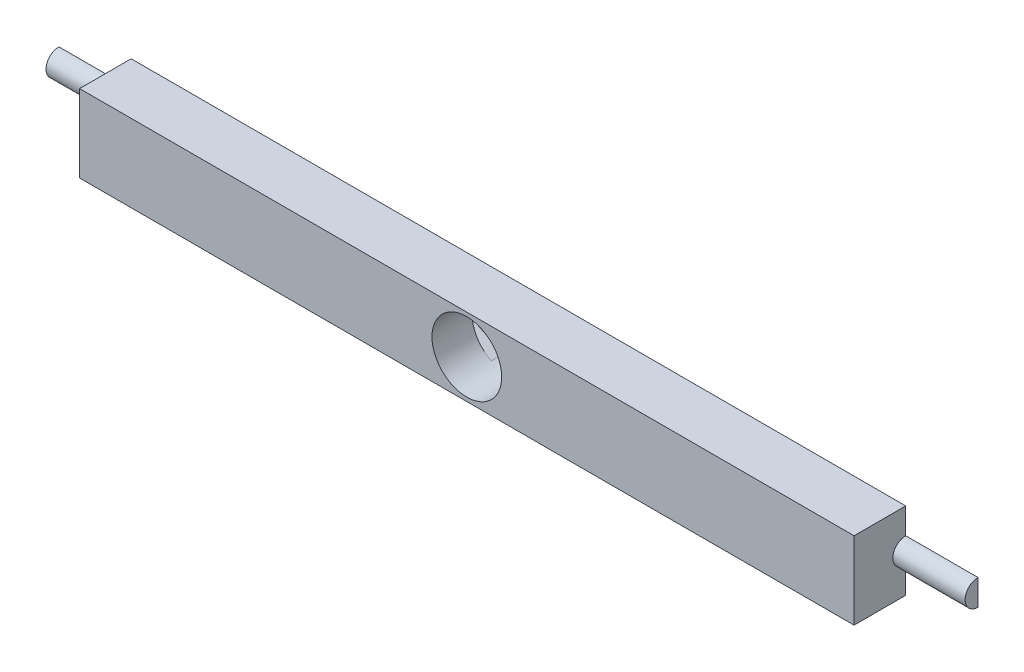
ISO-10303-21;
HEADER;
FILE_DESCRIPTION(('STEP AP214'),'2;1');
FILE_NAME('part.step','',(''),(''),'','','');
FILE_SCHEMA(('AUTOMOTIVE_DESIGN { 1 0 10303 214 1 1 1 1 }'));
ENDSEC;
DATA;
#1=APPLICATION_CONTEXT('core data for automotive mechanical design processes');
#2=APPLICATION_PROTOCOL_DEFINITION('international standard','automotive_design',2000,#1);
#3=PRODUCT_CONTEXT('',#1,'mechanical');
#4=PRODUCT('Part','Part','',(#3));
#5=PRODUCT_RELATED_PRODUCT_CATEGORY('part','',(#4));
#6=PRODUCT_DEFINITION_FORMATION('','',#4);
#7=PRODUCT_DEFINITION_CONTEXT('part definition',#1,'design');
#8=PRODUCT_DEFINITION('design','',#6,#7);
#9=PRODUCT_DEFINITION_SHAPE('','',#8);
#10=(LENGTH_UNIT() NAMED_UNIT(*) SI_UNIT(.MILLI.,.METRE.));
#11=(NAMED_UNIT(*) PLANE_ANGLE_UNIT() SI_UNIT($,.RADIAN.));
#12=(NAMED_UNIT(*) SI_UNIT($,.STERADIAN.) SOLID_ANGLE_UNIT());
#13=UNCERTAINTY_MEASURE_WITH_UNIT(LENGTH_MEASURE(1.E-05),#10,'distance_accuracy_value','');
#14=(GEOMETRIC_REPRESENTATION_CONTEXT(3) GLOBAL_UNCERTAINTY_ASSIGNED_CONTEXT((#13)) GLOBAL_UNIT_ASSIGNED_CONTEXT((#10,
#11,#12)) REPRESENTATION_CONTEXT('',''));
#15=CARTESIAN_POINT('',(0.,0.,0.));
#16=DIRECTION('',(0.,0.,1.));
#17=DIRECTION('',(1.,0.,0.));
#18=AXIS2_PLACEMENT_3D('',#15,#16,#17);
#19=CARTESIAN_POINT('',(150.,0.,20.));
#20=DIRECTION('',(0.,-1.,0.));
#21=DIRECTION('',(0.,0.,-1.));
#22=AXIS2_PLACEMENT_3D('',#19,#20,#21);
#23=PLANE('',#22);
#24=DIRECTION('',(-1.,0.,0.));
#25=VECTOR('',#24,1.);
#26=CARTESIAN_POINT('',(150.,0.,0.));
#27=LINE('',#26,#25);
#28=CARTESIAN_POINT('',(150.,0.,0.));
#29=VERTEX_POINT('',#28);
#30=CARTESIAN_POINT('',(-150.,0.,0.));
#31=VERTEX_POINT('',#30);
#32=EDGE_CURVE('E255',#29,#31,#27,.T.);
#33=ORIENTED_EDGE('',*,*,#32,.F.);
#34=DIRECTION('',(0.,0.,-1.));
#35=VECTOR('',#34,1.);
#36=CARTESIAN_POINT('',(150.,0.,20.));
#37=LINE('',#36,#35);
#38=CARTESIAN_POINT('',(150.,0.,20.));
#39=VERTEX_POINT('',#38);
#40=EDGE_CURVE('E11',#39,#29,#37,.T.);
#41=ORIENTED_EDGE('',*,*,#40,.F.);
#42=DIRECTION('',(-1.,0.,0.));
#43=VECTOR('',#42,1.);
#44=CARTESIAN_POINT('',(150.,0.,20.));
#45=LINE('',#44,#43);
#46=CARTESIAN_POINT('',(-150.,0.,20.));
#47=VERTEX_POINT('',#46);
#48=EDGE_CURVE('E256',#39,#47,#45,.T.);
#49=ORIENTED_EDGE('',*,*,#48,.T.);
#50=DIRECTION('',(0.,0.,-1.));
#51=VECTOR('',#50,1.);
#52=CARTESIAN_POINT('',(-150.,0.,20.));
#53=LINE('',#52,#51);
#54=EDGE_CURVE('E44',#47,#31,#53,.T.);
#55=ORIENTED_EDGE('',*,*,#54,.T.);
#56=EDGE_LOOP('',(#33,#41,#49,#55));
#57=FACE_BOUND('',#56,.T.);
#58=ADVANCED_FACE('F41',(#57),#23,.T.);
#59=CARTESIAN_POINT('',(150.,30.,20.));
#60=DIRECTION('',(1.,0.,0.));
#61=DIRECTION('',(0.,0.,-1.));
#62=AXIS2_PLACEMENT_3D('',#59,#60,#61);
#63=PLANE('',#62);
#64=CARTESIAN_POINT('',(150.,15.,0.));
#65=DIRECTION('',(1.,0.,0.));
#66=DIRECTION('',(0.,0.,-1.));
#67=AXIS2_PLACEMENT_3D('',#64,#65,#66);
#68=CIRCLE('',#67,5.);
#69=CARTESIAN_POINT('',(150.,20.,0.));
#70=VERTEX_POINT('',#69);
#71=CARTESIAN_POINT('',(150.,10.,0.));
#72=VERTEX_POINT('',#71);
#73=EDGE_CURVE('E252',#70,#72,#68,.T.);
#74=ORIENTED_EDGE('',*,*,#73,.F.);
#75=DIRECTION('',(0.,-1.,0.));
#76=VECTOR('',#75,1.);
#77=CARTESIAN_POINT('',(150.,30.,0.));
#78=LINE('',#77,#76);
#79=CARTESIAN_POINT('',(150.,30.,0.));
#80=VERTEX_POINT('',#79);
#81=EDGE_CURVE('E260',#80,#70,#78,.T.);
#82=ORIENTED_EDGE('',*,*,#81,.F.);
#83=DIRECTION('',(0.,0.,-1.));
#84=VECTOR('',#83,1.);
#85=CARTESIAN_POINT('',(150.,30.,20.));
#86=LINE('',#85,#84);
#87=CARTESIAN_POINT('',(150.,30.,20.));
#88=VERTEX_POINT('',#87);
#89=EDGE_CURVE('E49',#88,#80,#86,.T.);
#90=ORIENTED_EDGE('',*,*,#89,.F.);
#91=DIRECTION('',(0.,-1.,0.));
#92=VECTOR('',#91,1.);
#93=CARTESIAN_POINT('',(150.,30.,20.));
#94=LINE('',#93,#92);
#95=EDGE_CURVE('E266',#88,#39,#94,.T.);
#96=ORIENTED_EDGE('',*,*,#95,.T.);
#97=ORIENTED_EDGE('',*,*,#40,.T.);
#98=EDGE_CURVE('E278',#72,#29,#78,.T.);
#99=ORIENTED_EDGE('',*,*,#98,.F.);
#100=EDGE_LOOP('',(#74,#82,#90,#96,#97,#99));
#101=FACE_BOUND('',#100,.T.);
#102=ADVANCED_FACE('F295',(#101),#63,.T.);
#103=CARTESIAN_POINT('',(-150.,30.,20.));
#104=DIRECTION('',(0.,1.,0.));
#105=DIRECTION('',(0.,0.,1.));
#106=AXIS2_PLACEMENT_3D('',#103,#104,#105);
#107=PLANE('',#106);
#108=DIRECTION('',(1.,0.,0.));
#109=VECTOR('',#108,1.);
#110=CARTESIAN_POINT('',(-150.,30.,0.));
#111=LINE('',#110,#109);
#112=CARTESIAN_POINT('',(-150.,30.,0.));
#113=VERTEX_POINT('',#112);
#114=EDGE_CURVE('E275',#113,#80,#111,.T.);
#115=ORIENTED_EDGE('',*,*,#114,.F.);
#116=DIRECTION('',(0.,0.,-1.));
#117=VECTOR('',#116,1.);
#118=CARTESIAN_POINT('',(-150.,30.,20.));
#119=LINE('',#118,#117);
#120=CARTESIAN_POINT('',(-150.,30.,20.));
#121=VERTEX_POINT('',#120);
#122=EDGE_CURVE('E281',#121,#113,#119,.T.);
#123=ORIENTED_EDGE('',*,*,#122,.F.);
#124=DIRECTION('',(1.,0.,0.));
#125=VECTOR('',#124,1.);
#126=CARTESIAN_POINT('',(-150.,30.,20.));
#127=LINE('',#126,#125);
#128=EDGE_CURVE('E263',#121,#88,#127,.T.);
#129=ORIENTED_EDGE('',*,*,#128,.T.);
#130=ORIENTED_EDGE('',*,*,#89,.T.);
#131=EDGE_LOOP('',(#115,#123,#129,#130));
#132=FACE_BOUND('',#131,.T.);
#133=ADVANCED_FACE('F301',(#132),#107,.T.);
#134=CARTESIAN_POINT('',(-150.,0.,20.));
#135=DIRECTION('',(-1.,0.,0.));
#136=DIRECTION('',(0.,0.,1.));
#137=AXIS2_PLACEMENT_3D('',#134,#135,#136);
#138=PLANE('',#137);
#139=CARTESIAN_POINT('',(-150.,15.,0.));
#140=DIRECTION('',(-1.,0.,0.));
#141=DIRECTION('',(0.,0.,1.));
#142=AXIS2_PLACEMENT_3D('',#139,#140,#141);
#143=CIRCLE('',#142,5.);
#144=CARTESIAN_POINT('',(-150.,10.,0.));
#145=VERTEX_POINT('',#144);
#146=CARTESIAN_POINT('',(-150.,20.,0.));
#147=VERTEX_POINT('',#146);
#148=EDGE_CURVE('E245',#145,#147,#143,.T.);
#149=ORIENTED_EDGE('',*,*,#148,.F.);
#150=DIRECTION('',(0.,1.,0.));
#151=VECTOR('',#150,1.);
#152=CARTESIAN_POINT('',(-150.,0.,0.));
#153=LINE('',#152,#151);
#154=EDGE_CURVE('E272',#31,#145,#153,.T.);
#155=ORIENTED_EDGE('',*,*,#154,.F.);
#156=ORIENTED_EDGE('',*,*,#54,.F.);
#157=DIRECTION('',(0.,1.,0.));
#158=VECTOR('',#157,1.);
#159=CARTESIAN_POINT('',(-150.,0.,20.));
#160=LINE('',#159,#158);
#161=EDGE_CURVE('E259',#47,#121,#160,.T.);
#162=ORIENTED_EDGE('',*,*,#161,.T.);
#163=ORIENTED_EDGE('',*,*,#122,.T.);
#164=EDGE_CURVE('E271',#147,#113,#153,.T.);
#165=ORIENTED_EDGE('',*,*,#164,.F.);
#166=EDGE_LOOP('',(#149,#155,#156,#162,#163,#165));
#167=FACE_BOUND('',#166,.T.);
#168=ADVANCED_FACE('F290',(#167),#138,.T.);
#169=CARTESIAN_POINT('',(0.,0.,20.));
#170=DIRECTION('',(0.,0.,-1.));
#171=DIRECTION('',(-1.,0.,0.));
#172=AXIS2_PLACEMENT_3D('',#169,#170,#171);
#173=PLANE('',#172);
#174=CARTESIAN_POINT('',(0.,15.,20.));
#175=DIRECTION('',(0.,0.,-1.));
#176=DIRECTION('',(-1.,0.,0.));
#177=AXIS2_PLACEMENT_3D('',#174,#175,#176);
#178=CIRCLE('',#177,13.5);
#179=CARTESIAN_POINT('',(-13.5,15.,20.));
#180=VERTEX_POINT('',#179);
#181=EDGE_CURVE('E223',#180,#180,#178,.T.);
#182=ORIENTED_EDGE('',*,*,#181,.T.);
#183=EDGE_LOOP('',(#182));
#184=FACE_BOUND('',#183,.T.);
#185=ORIENTED_EDGE('',*,*,#48,.F.);
#186=ORIENTED_EDGE('',*,*,#95,.F.);
#187=ORIENTED_EDGE('',*,*,#128,.F.);
#188=ORIENTED_EDGE('',*,*,#161,.F.);
#189=EDGE_LOOP('',(#185,#186,#187,#188));
#190=FACE_BOUND('',#189,.T.);
#191=ADVANCED_FACE('F298',(#184,#190),#173,.F.);
#192=CARTESIAN_POINT('',(0.,0.,0.));
#193=DIRECTION('',(0.,0.,-1.));
#194=DIRECTION('',(-1.,0.,0.));
#195=AXIS2_PLACEMENT_3D('',#192,#193,#194);
#196=PLANE('',#195);
#197=DIRECTION('',(0.895059893691129,-0.445945945945946,0.));
#198=VECTOR('',#197,1.);
#199=CARTESIAN_POINT('',(12.0074952348258,24.1002917642459,0.));
#200=LINE('',#199,#198);
#201=CARTESIAN_POINT('',(6.02027027027027,27.0833085648302,0.));
#202=VERTEX_POINT('',#201);
#203=CARTESIAN_POINT('',(20.8412162162162,19.6990644418784,0.));
#204=VERTEX_POINT('',#203);
#205=EDGE_CURVE('E162',#202,#204,#200,.T.);
#206=ORIENTED_EDGE('',*,*,#205,.F.);
#207=CARTESIAN_POINT('',(0.,15.,0.));
#208=DIRECTION('',(0.,0.,-1.));
#209=DIRECTION('',(-1.,0.,0.));
#210=AXIS2_PLACEMENT_3D('',#207,#208,#209);
#211=CIRCLE('',#210,13.5);
#212=CARTESIAN_POINT('',(-6.02027027027027,27.0833085648302,0.));
#213=VERTEX_POINT('',#212);
#214=EDGE_CURVE('E227',#213,#202,#211,.T.);
#215=ORIENTED_EDGE('',*,*,#214,.F.);
#216=DIRECTION('',(-0.895059893691129,-0.445945945945946,0.));
#217=VECTOR('',#216,1.);
#218=CARTESIAN_POINT('',(-12.0074952348258,24.1002917642459,0.));
#219=LINE('',#218,#217);
#220=CARTESIAN_POINT('',(-20.8412162162162,19.6990644418784,0.));
#221=VERTEX_POINT('',#220);
#222=EDGE_CURVE('E211',#213,#221,#219,.T.);
#223=ORIENTED_EDGE('',*,*,#222,.T.);
#224=CARTESIAN_POINT('',(-18.5,15.,0.));
#225=DIRECTION('',(0.,0.,-1.));
#226=DIRECTION('',(-1.,0.,0.));
#227=AXIS2_PLACEMENT_3D('',#224,#225,#226);
#228=CIRCLE('',#227,5.25);
#229=CARTESIAN_POINT('',(-20.8412162162162,10.3009355581216,0.));
#230=VERTEX_POINT('',#229);
#231=EDGE_CURVE('E208',#221,#230,#228,.F.);
#232=ORIENTED_EDGE('',*,*,#231,.T.);
#233=DIRECTION('',(-0.895059893691129,0.445945945945946,0.));
#234=VECTOR('',#233,1.);
#235=CARTESIAN_POINT('',(-0.0330453057147466,-0.0663253654146171,0.));
#236=LINE('',#235,#234);
#237=CARTESIAN_POINT('',(-6.02027027027027,2.91669143516975,0.));
#238=VERTEX_POINT('',#237);
#239=EDGE_CURVE('E199',#238,#230,#236,.T.);
#240=ORIENTED_EDGE('',*,*,#239,.F.);
#241=CARTESIAN_POINT('',(6.02027027027027,2.91669143516975,0.));
#242=VERTEX_POINT('',#241);
#243=EDGE_CURVE('E194',#242,#238,#211,.T.);
#244=ORIENTED_EDGE('',*,*,#243,.F.);
#245=DIRECTION('',(0.895059893691129,0.445945945945946,0.));
#246=VECTOR('',#245,1.);
#247=CARTESIAN_POINT('',(0.0330453057147466,-0.0663253654146171,0.));
#248=LINE('',#247,#246);
#249=CARTESIAN_POINT('',(20.8412162162162,10.3009355581216,0.));
#250=VERTEX_POINT('',#249);
#251=EDGE_CURVE('E178',#242,#250,#248,.T.);
#252=ORIENTED_EDGE('',*,*,#251,.T.);
#253=CARTESIAN_POINT('',(18.5,15.,0.));
#254=DIRECTION('',(0.,0.,-1.));
#255=DIRECTION('',(-1.,0.,0.));
#256=AXIS2_PLACEMENT_3D('',#253,#254,#255);
#257=CIRCLE('',#256,5.25);
#258=EDGE_CURVE('E181',#204,#250,#257,.T.);
#259=ORIENTED_EDGE('',*,*,#258,.F.);
#260=EDGE_LOOP('',(#206,#215,#223,#232,#240,#244,#252,#259));
#261=FACE_BOUND('',#260,.T.);
#262=ORIENTED_EDGE('',*,*,#81,.T.);
#263=DIRECTION('',(-1.,0.,0.));
#264=VECTOR('',#263,1.);
#265=CARTESIAN_POINT('',(178.,20.,0.));
#266=LINE('',#265,#264);
#267=CARTESIAN_POINT('',(178.,20.,0.));
#268=VERTEX_POINT('',#267);
#269=EDGE_CURVE('E242',#268,#70,#266,.T.);
#270=ORIENTED_EDGE('',*,*,#269,.F.);
#271=DIRECTION('',(0.,-1.,0.));
#272=VECTOR('',#271,1.);
#273=CARTESIAN_POINT('',(178.,20.,0.));
#274=LINE('',#273,#272);
#275=CARTESIAN_POINT('',(178.,10.,0.));
#276=VERTEX_POINT('',#275);
#277=EDGE_CURVE('E235',#268,#276,#274,.T.);
#278=ORIENTED_EDGE('',*,*,#277,.T.);
#279=DIRECTION('',(-1.,0.,0.));
#280=VECTOR('',#279,1.);
#281=CARTESIAN_POINT('',(178.,10.,0.));
#282=LINE('',#281,#280);
#283=EDGE_CURVE('E247',#276,#72,#282,.T.);
#284=ORIENTED_EDGE('',*,*,#283,.T.);
#285=ORIENTED_EDGE('',*,*,#98,.T.);
#286=ORIENTED_EDGE('',*,*,#32,.T.);
#287=ORIENTED_EDGE('',*,*,#154,.T.);
#288=CARTESIAN_POINT('',(-178.,10.,0.));
#289=VERTEX_POINT('',#288);
#290=EDGE_CURVE('E241',#145,#289,#282,.T.);
#291=ORIENTED_EDGE('',*,*,#290,.T.);
#292=DIRECTION('',(0.,-1.,0.));
#293=VECTOR('',#292,1.);
#294=CARTESIAN_POINT('',(-178.,20.,0.));
#295=LINE('',#294,#293);
#296=CARTESIAN_POINT('',(-178.,20.,0.));
#297=VERTEX_POINT('',#296);
#298=EDGE_CURVE('E226',#297,#289,#295,.T.);
#299=ORIENTED_EDGE('',*,*,#298,.F.);
#300=EDGE_CURVE('E246',#147,#297,#266,.T.);
#301=ORIENTED_EDGE('',*,*,#300,.F.);
#302=ORIENTED_EDGE('',*,*,#164,.T.);
#303=ORIENTED_EDGE('',*,*,#114,.T.);
#304=EDGE_LOOP('',(#262,#270,#278,#284,#285,#286,#287,#291,#299,#301,#302,#303));
#305=FACE_BOUND('',#304,.T.);
#306=ADVANCED_FACE('F293',(#261,#305),#196,.T.);
#307=CARTESIAN_POINT('',(-178.,15.,0.));
#308=DIRECTION('',(-1.,0.,0.));
#309=DIRECTION('',(0.,0.,1.));
#310=AXIS2_PLACEMENT_3D('',#307,#308,#309);
#311=PLANE('',#310);
#312=ORIENTED_EDGE('',*,*,#298,.T.);
#313=CARTESIAN_POINT('',(-178.,15.,0.));
#314=DIRECTION('',(-1.,0.,0.));
#315=DIRECTION('',(0.,0.,1.));
#316=AXIS2_PLACEMENT_3D('',#313,#314,#315);
#317=CIRCLE('',#316,5.);
#318=EDGE_CURVE('E232',#289,#297,#317,.T.);
#319=ORIENTED_EDGE('',*,*,#318,.T.);
#320=EDGE_LOOP('',(#312,#319));
#321=FACE_BOUND('',#320,.T.);
#322=ADVANCED_FACE('F343',(#321),#311,.T.);
#323=CARTESIAN_POINT('',(178.,15.,0.));
#324=DIRECTION('',(-1.,0.,0.));
#325=DIRECTION('',(0.,0.,1.));
#326=AXIS2_PLACEMENT_3D('',#323,#324,#325);
#327=CYLINDRICAL_SURFACE('',#326,5.);
#328=ORIENTED_EDGE('',*,*,#290,.F.);
#329=ORIENTED_EDGE('',*,*,#148,.T.);
#330=ORIENTED_EDGE('',*,*,#300,.T.);
#331=ORIENTED_EDGE('',*,*,#318,.F.);
#332=EDGE_LOOP('',(#328,#329,#330,#331));
#333=FACE_BOUND('',#332,.T.);
#334=ADVANCED_FACE('F321',(#333),#327,.T.);
#335=ORIENTED_EDGE('',*,*,#269,.T.);
#336=ORIENTED_EDGE('',*,*,#73,.T.);
#337=ORIENTED_EDGE('',*,*,#283,.F.);
#338=CARTESIAN_POINT('',(178.,15.,0.));
#339=DIRECTION('',(-1.,0.,0.));
#340=DIRECTION('',(0.,0.,1.));
#341=AXIS2_PLACEMENT_3D('',#338,#339,#340);
#342=CIRCLE('',#341,5.);
#343=EDGE_CURVE('E238',#276,#268,#342,.T.);
#344=ORIENTED_EDGE('',*,*,#343,.T.);
#345=EDGE_LOOP('',(#335,#336,#337,#344));
#346=FACE_BOUND('',#345,.T.);
#347=ADVANCED_FACE('F305',(#346),#327,.T.);
#348=CARTESIAN_POINT('',(178.,15.,0.));
#349=DIRECTION('',(-1.,0.,0.));
#350=DIRECTION('',(0.,0.,1.));
#351=AXIS2_PLACEMENT_3D('',#348,#349,#350);
#352=PLANE('',#351);
#353=ORIENTED_EDGE('',*,*,#277,.F.);
#354=ORIENTED_EDGE('',*,*,#343,.F.);
#355=EDGE_LOOP('',(#353,#354));
#356=FACE_BOUND('',#355,.T.);
#357=ADVANCED_FACE('F309',(#356),#352,.F.);
#358=CARTESIAN_POINT('',(0.,15.,20.));
#359=DIRECTION('',(0.,0.,-1.));
#360=DIRECTION('',(-1.,0.,0.));
#361=AXIS2_PLACEMENT_3D('',#358,#359,#360);
#362=CYLINDRICAL_SURFACE('',#361,13.5);
#363=ORIENTED_EDGE('',*,*,#181,.F.);
#364=EDGE_LOOP('',(#363));
#365=FACE_BOUND('',#364,.T.);
#366=ORIENTED_EDGE('',*,*,#214,.T.);
#367=DIRECTION('',(0.,0.,-1.));
#368=VECTOR('',#367,1.);
#369=CARTESIAN_POINT('',(6.02027027027027,27.0833085648302,4.5));
#370=LINE('',#369,#368);
#371=CARTESIAN_POINT('',(6.02027027027027,27.0833085648302,4.5));
#372=VERTEX_POINT('',#371);
#373=EDGE_CURVE('E192',#372,#202,#370,.T.);
#374=ORIENTED_EDGE('',*,*,#373,.F.);
#375=CARTESIAN_POINT('',(0.,15.,4.5));
#376=DIRECTION('',(0.,0.,-1.));
#377=DIRECTION('',(-1.,0.,0.));
#378=AXIS2_PLACEMENT_3D('',#375,#376,#377);
#379=CIRCLE('',#378,13.5);
#380=CARTESIAN_POINT('',(6.02027027027027,2.91669143516976,4.5));
#381=VERTEX_POINT('',#380);
#382=EDGE_CURVE('E167',#372,#381,#379,.T.);
#383=ORIENTED_EDGE('',*,*,#382,.T.);
#384=DIRECTION('',(0.,0.,-1.));
#385=VECTOR('',#384,1.);
#386=CARTESIAN_POINT('',(6.02027027027027,2.91669143516975,4.5));
#387=LINE('',#386,#385);
#388=EDGE_CURVE('E57',#381,#242,#387,.T.);
#389=ORIENTED_EDGE('',*,*,#388,.T.);
#390=ORIENTED_EDGE('',*,*,#243,.T.);
#391=DIRECTION('',(0.,0.,-1.));
#392=VECTOR('',#391,1.);
#393=CARTESIAN_POINT('',(-6.02027027027027,2.91669143516975,4.5));
#394=LINE('',#393,#392);
#395=CARTESIAN_POINT('',(-6.02027027027027,2.91669143516975,4.5));
#396=VERTEX_POINT('',#395);
#397=EDGE_CURVE('E217',#396,#238,#394,.T.);
#398=ORIENTED_EDGE('',*,*,#397,.F.);
#399=CARTESIAN_POINT('',(0.,15.,4.5));
#400=DIRECTION('',(0.,0.,-1.));
#401=DIRECTION('',(-1.,0.,0.));
#402=AXIS2_PLACEMENT_3D('',#399,#400,#401);
#403=CIRCLE('',#402,13.5);
#404=CARTESIAN_POINT('',(-6.02027027027027,27.0833085648302,4.5));
#405=VERTEX_POINT('',#404);
#406=EDGE_CURVE('E201',#396,#405,#403,.T.);
#407=ORIENTED_EDGE('',*,*,#406,.T.);
#408=DIRECTION('',(0.,0.,-1.));
#409=VECTOR('',#408,1.);
#410=CARTESIAN_POINT('',(-6.02027027027027,27.0833085648302,4.5));
#411=LINE('',#410,#409);
#412=EDGE_CURVE('E219',#405,#213,#411,.T.);
#413=ORIENTED_EDGE('',*,*,#412,.T.);
#414=EDGE_LOOP('',(#366,#374,#383,#389,#390,#398,#407,#413));
#415=FACE_BOUND('',#414,.T.);
#416=ADVANCED_FACE('F311',(#365,#415),#362,.F.);
#417=CARTESIAN_POINT('',(-18.5,15.,4.5));
#418=DIRECTION('',(0.,0.,-1.));
#419=DIRECTION('',(-1.,0.,0.));
#420=AXIS2_PLACEMENT_3D('',#417,#418,#419);
#421=CYLINDRICAL_SURFACE('',#420,5.25);
#422=ORIENTED_EDGE('',*,*,#231,.F.);
#423=DIRECTION('',(0.,0.,-1.));
#424=VECTOR('',#423,1.);
#425=CARTESIAN_POINT('',(-20.8412162162162,19.6990644418784,4.5));
#426=LINE('',#425,#424);
#427=CARTESIAN_POINT('',(-20.8412162162162,19.6990644418784,4.5));
#428=VERTEX_POINT('',#427);
#429=EDGE_CURVE('E207',#428,#221,#426,.T.);
#430=ORIENTED_EDGE('',*,*,#429,.F.);
#431=CARTESIAN_POINT('',(-18.5,15.,4.5));
#432=DIRECTION('',(0.,0.,-1.));
#433=DIRECTION('',(-1.,0.,0.));
#434=AXIS2_PLACEMENT_3D('',#431,#432,#433);
#435=CIRCLE('',#434,5.25);
#436=CARTESIAN_POINT('',(-20.8412162162162,10.3009355581216,4.5));
#437=VERTEX_POINT('',#436);
#438=EDGE_CURVE('E197',#428,#437,#435,.F.);
#439=ORIENTED_EDGE('',*,*,#438,.T.);
#440=DIRECTION('',(0.,0.,-1.));
#441=VECTOR('',#440,1.);
#442=CARTESIAN_POINT('',(-20.8412162162162,10.3009355581216,4.5));
#443=LINE('',#442,#441);
#444=EDGE_CURVE('E190',#437,#230,#443,.T.);
#445=ORIENTED_EDGE('',*,*,#444,.T.);
#446=EDGE_LOOP('',(#422,#430,#439,#445));
#447=FACE_BOUND('',#446,.T.);
#448=ADVANCED_FACE('F318',(#447),#421,.F.);
#449=CARTESIAN_POINT('',(-0.0330453057147466,-0.0663253654146171,4.5));
#450=DIRECTION('',(-0.445945945945946,-0.895059893691129,0.));
#451=DIRECTION('',(0.895059893691129,-0.445945945945946,0.));
#452=AXIS2_PLACEMENT_3D('',#449,#450,#451);
#453=PLANE('',#452);
#454=ORIENTED_EDGE('',*,*,#239,.T.);
#455=ORIENTED_EDGE('',*,*,#444,.F.);
#456=DIRECTION('',(-0.895059893691129,0.445945945945946,0.));
#457=VECTOR('',#456,1.);
#458=CARTESIAN_POINT('',(-0.0330453057147466,-0.0663253654146171,4.5));
#459=LINE('',#458,#457);
#460=EDGE_CURVE('E204',#396,#437,#459,.T.);
#461=ORIENTED_EDGE('',*,*,#460,.F.);
#462=ORIENTED_EDGE('',*,*,#397,.T.);
#463=EDGE_LOOP('',(#454,#455,#461,#462));
#464=FACE_BOUND('',#463,.T.);
#465=ADVANCED_FACE('F357',(#464),#453,.F.);
#466=CARTESIAN_POINT('',(-12.0074952348258,24.1002917642459,4.5));
#467=DIRECTION('',(0.445945945945946,-0.895059893691129,0.));
#468=DIRECTION('',(0.895059893691129,0.445945945945946,0.));
#469=AXIS2_PLACEMENT_3D('',#466,#467,#468);
#470=PLANE('',#469);
#471=ORIENTED_EDGE('',*,*,#222,.F.);
#472=ORIENTED_EDGE('',*,*,#412,.F.);
#473=DIRECTION('',(-0.895059893691129,-0.445945945945946,0.));
#474=VECTOR('',#473,1.);
#475=CARTESIAN_POINT('',(-12.0074952348258,24.1002917642459,4.5));
#476=LINE('',#475,#474);
#477=EDGE_CURVE('E65',#405,#428,#476,.T.);
#478=ORIENTED_EDGE('',*,*,#477,.T.);
#479=ORIENTED_EDGE('',*,*,#429,.T.);
#480=EDGE_LOOP('',(#471,#472,#478,#479));
#481=FACE_BOUND('',#480,.T.);
#482=ADVANCED_FACE('F359',(#481),#470,.T.);
#483=CARTESIAN_POINT('',(0.,0.,4.5));
#484=DIRECTION('',(0.,0.,-1.));
#485=DIRECTION('',(-1.,0.,0.));
#486=AXIS2_PLACEMENT_3D('',#483,#484,#485);
#487=PLANE('',#486);
#488=ORIENTED_EDGE('',*,*,#438,.F.);
#489=ORIENTED_EDGE('',*,*,#477,.F.);
#490=ORIENTED_EDGE('',*,*,#406,.F.);
#491=ORIENTED_EDGE('',*,*,#460,.T.);
#492=EDGE_LOOP('',(#488,#489,#490,#491));
#493=FACE_BOUND('',#492,.T.);
#494=CARTESIAN_POINT('',(-18.5,15.,4.5));
#495=DIRECTION('',(0.,0.,-1.));
#496=DIRECTION('',(-1.,0.,0.));
#497=AXIS2_PLACEMENT_3D('',#494,#495,#496);
#498=CIRCLE('',#497,2.4);
#499=CARTESIAN_POINT('',(-20.9,15.,4.5));
#500=VERTEX_POINT('',#499);
#501=EDGE_CURVE('E184',#500,#500,#498,.T.);
#502=ORIENTED_EDGE('',*,*,#501,.F.);
#503=EDGE_LOOP('',(#502));
#504=FACE_BOUND('',#503,.T.);
#505=ADVANCED_FACE('F362',(#493,#504),#487,.T.);
#506=CARTESIAN_POINT('',(12.0074952348258,24.1002917642459,4.5));
#507=DIRECTION('',(0.445945945945946,0.895059893691129,0.));
#508=DIRECTION('',(-0.895059893691129,0.445945945945946,0.));
#509=AXIS2_PLACEMENT_3D('',#506,#507,#508);
#510=PLANE('',#509);
#511=ORIENTED_EDGE('',*,*,#205,.T.);
#512=DIRECTION('',(0.,0.,-1.));
#513=VECTOR('',#512,1.);
#514=CARTESIAN_POINT('',(20.8412162162162,19.6990644418784,4.5));
#515=LINE('',#514,#513);
#516=CARTESIAN_POINT('',(20.8412162162162,19.6990644418784,4.5));
#517=VERTEX_POINT('',#516);
#518=EDGE_CURVE('E155',#517,#204,#515,.T.);
#519=ORIENTED_EDGE('',*,*,#518,.F.);
#520=DIRECTION('',(0.895059893691129,-0.445945945945946,0.));
#521=VECTOR('',#520,1.);
#522=CARTESIAN_POINT('',(12.0074952348258,24.1002917642459,4.5));
#523=LINE('',#522,#521);
#524=EDGE_CURVE('E159',#372,#517,#523,.T.);
#525=ORIENTED_EDGE('',*,*,#524,.F.);
#526=ORIENTED_EDGE('',*,*,#373,.T.);
#527=EDGE_LOOP('',(#511,#519,#525,#526));
#528=FACE_BOUND('',#527,.T.);
#529=ADVANCED_FACE('F157',(#528),#510,.F.);
#530=CARTESIAN_POINT('',(0.0330453057147466,-0.0663253654146171,4.5));
#531=DIRECTION('',(-0.445945945945946,0.895059893691129,0.));
#532=DIRECTION('',(-0.895059893691129,-0.445945945945946,0.));
#533=AXIS2_PLACEMENT_3D('',#530,#531,#532);
#534=PLANE('',#533);
#535=ORIENTED_EDGE('',*,*,#251,.F.);
#536=ORIENTED_EDGE('',*,*,#388,.F.);
#537=DIRECTION('',(0.895059893691129,0.445945945945946,0.));
#538=VECTOR('',#537,1.);
#539=CARTESIAN_POINT('',(0.0330453057147466,-0.0663253654146171,4.5));
#540=LINE('',#539,#538);
#541=CARTESIAN_POINT('',(20.8412162162162,10.3009355581216,4.5));
#542=VERTEX_POINT('',#541);
#543=EDGE_CURVE('E174',#381,#542,#540,.T.);
#544=ORIENTED_EDGE('',*,*,#543,.T.);
#545=DIRECTION('',(0.,0.,-1.));
#546=VECTOR('',#545,1.);
#547=CARTESIAN_POINT('',(20.8412162162162,10.3009355581216,4.5));
#548=LINE('',#547,#546);
#549=EDGE_CURVE('E166',#542,#250,#548,.T.);
#550=ORIENTED_EDGE('',*,*,#549,.T.);
#551=EDGE_LOOP('',(#535,#536,#544,#550));
#552=FACE_BOUND('',#551,.T.);
#553=ADVANCED_FACE('F371',(#552),#534,.T.);
#554=CARTESIAN_POINT('',(18.5,15.,4.5));
#555=DIRECTION('',(0.,0.,-1.));
#556=DIRECTION('',(-1.,0.,0.));
#557=AXIS2_PLACEMENT_3D('',#554,#555,#556);
#558=CYLINDRICAL_SURFACE('',#557,5.25);
#559=ORIENTED_EDGE('',*,*,#258,.T.);
#560=ORIENTED_EDGE('',*,*,#549,.F.);
#561=CARTESIAN_POINT('',(18.5,15.,4.5));
#562=DIRECTION('',(0.,0.,-1.));
#563=DIRECTION('',(-1.,0.,0.));
#564=AXIS2_PLACEMENT_3D('',#561,#562,#563);
#565=CIRCLE('',#564,5.25);
#566=EDGE_CURVE('E171',#517,#542,#565,.T.);
#567=ORIENTED_EDGE('',*,*,#566,.F.);
#568=ORIENTED_EDGE('',*,*,#518,.T.);
#569=EDGE_LOOP('',(#559,#560,#567,#568));
#570=FACE_BOUND('',#569,.T.);
#571=ADVANCED_FACE('F172',(#570),#558,.F.);
#572=CARTESIAN_POINT('',(0.,0.,4.5));
#573=DIRECTION('',(0.,0.,-1.));
#574=DIRECTION('',(-1.,0.,0.));
#575=AXIS2_PLACEMENT_3D('',#572,#573,#574);
#576=PLANE('',#575);
#577=CARTESIAN_POINT('',(18.5,15.,4.5));
#578=DIRECTION('',(0.,0.,-1.));
#579=DIRECTION('',(-1.,0.,0.));
#580=AXIS2_PLACEMENT_3D('',#577,#578,#579);
#581=CIRCLE('',#580,2.4);
#582=CARTESIAN_POINT('',(16.1,15.,4.5));
#583=VERTEX_POINT('',#582);
#584=EDGE_CURVE('E400',#583,#583,#581,.F.);
#585=ORIENTED_EDGE('',*,*,#584,.T.);
#586=EDGE_LOOP('',(#585));
#587=FACE_BOUND('',#586,.T.);
#588=ORIENTED_EDGE('',*,*,#524,.T.);
#589=ORIENTED_EDGE('',*,*,#566,.T.);
#590=ORIENTED_EDGE('',*,*,#543,.F.);
#591=ORIENTED_EDGE('',*,*,#382,.F.);
#592=EDGE_LOOP('',(#588,#589,#590,#591));
#593=FACE_BOUND('',#592,.T.);
#594=ADVANCED_FACE('F176',(#587,#593),#576,.T.);
#595=CARTESIAN_POINT('',(18.5,15.,5.));
#596=DIRECTION('',(0.,0.,-1.));
#597=DIRECTION('',(-1.,0.,0.));
#598=AXIS2_PLACEMENT_3D('',#595,#596,#597);
#599=CYLINDRICAL_SURFACE('',#598,2.4);
#600=ORIENTED_EDGE('',*,*,#584,.F.);
#601=EDGE_LOOP('',(#600));
#602=FACE_BOUND('',#601,.T.);
#603=CARTESIAN_POINT('',(18.5,15.,5.));
#604=DIRECTION('',(0.,0.,-1.));
#605=DIRECTION('',(-1.,0.,0.));
#606=AXIS2_PLACEMENT_3D('',#603,#604,#605);
#607=CIRCLE('',#606,2.4);
#608=CARTESIAN_POINT('',(16.1,15.,5.));
#609=VERTEX_POINT('',#608);
#610=EDGE_CURVE('E398',#609,#609,#607,.F.);
#611=ORIENTED_EDGE('',*,*,#610,.T.);
#612=EDGE_LOOP('',(#611));
#613=FACE_BOUND('',#612,.T.);
#614=ADVANCED_FACE('F378',(#602,#613),#599,.F.);
#615=CARTESIAN_POINT('',(0.,0.,5.));
#616=DIRECTION('',(0.,0.,-1.));
#617=DIRECTION('',(-1.,0.,0.));
#618=AXIS2_PLACEMENT_3D('',#615,#616,#617);
#619=PLANE('',#618);
#620=ORIENTED_EDGE('',*,*,#610,.F.);
#621=EDGE_LOOP('',(#620));
#622=FACE_BOUND('',#621,.T.);
#623=ADVANCED_FACE('F384',(#622),#619,.T.);
#624=CARTESIAN_POINT('',(-18.5,15.,5.));
#625=DIRECTION('',(0.,0.,-1.));
#626=DIRECTION('',(-1.,0.,0.));
#627=AXIS2_PLACEMENT_3D('',#624,#625,#626);
#628=CYLINDRICAL_SURFACE('',#627,2.4);
#629=ORIENTED_EDGE('',*,*,#501,.T.);
#630=EDGE_LOOP('',(#629));
#631=FACE_BOUND('',#630,.T.);
#632=CARTESIAN_POINT('',(-18.5,15.,5.));
#633=DIRECTION('',(0.,0.,-1.));
#634=DIRECTION('',(-1.,0.,0.));
#635=AXIS2_PLACEMENT_3D('',#632,#633,#634);
#636=CIRCLE('',#635,2.4);
#637=CARTESIAN_POINT('',(-20.9,15.,5.));
#638=VERTEX_POINT('',#637);
#639=EDGE_CURVE('E401',#638,#638,#636,.T.);
#640=ORIENTED_EDGE('',*,*,#639,.F.);
#641=EDGE_LOOP('',(#640));
#642=FACE_BOUND('',#641,.T.);
#643=ADVANCED_FACE('F380',(#631,#642),#628,.F.);
#644=CARTESIAN_POINT('',(0.,0.,5.));
#645=DIRECTION('',(0.,0.,-1.));
#646=DIRECTION('',(-1.,0.,0.));
#647=AXIS2_PLACEMENT_3D('',#644,#645,#646);
#648=PLANE('',#647);
#649=ORIENTED_EDGE('',*,*,#639,.T.);
#650=EDGE_LOOP('',(#649));
#651=FACE_BOUND('',#650,.T.);
#652=ADVANCED_FACE('F383',(#651),#648,.T.);
#653=CLOSED_SHELL('',(#58,#102,#133,#168,#191,#306,#322,#334,#347,#357,#416,#448,#465,#482,#505,
#529,#553,#571,#594,#614,#623,#643,#652));
#654=MANIFOLD_SOLID_BREP('B2',#653);
#655=ADVANCED_BREP_SHAPE_REPRESENTATION('',(#18,#654),#14);
#656=SHAPE_DEFINITION_REPRESENTATION(#9,#655);
ENDSEC;
END-ISO-10303-21;
